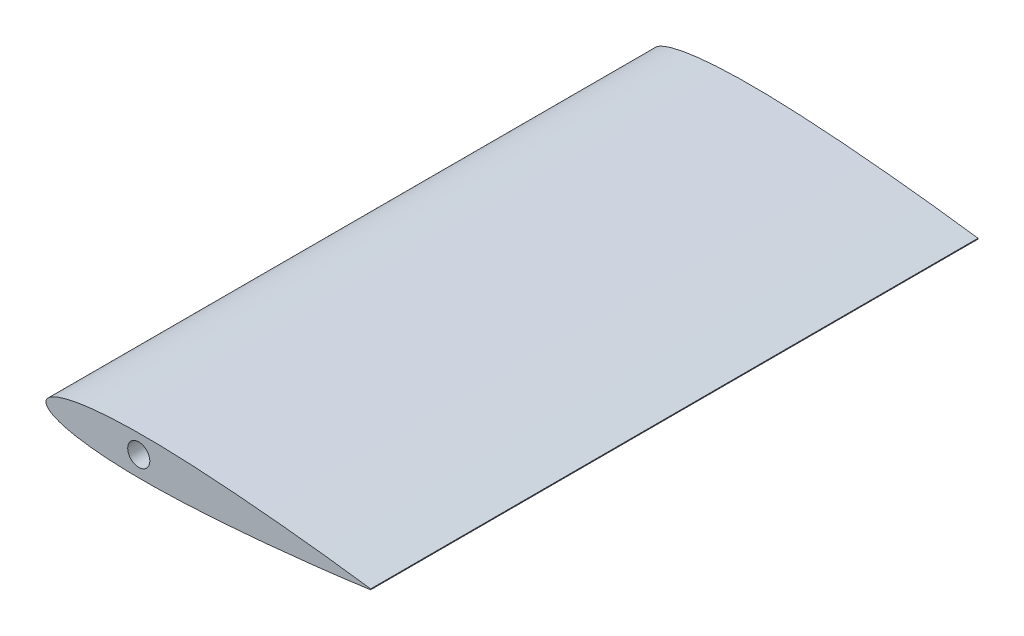
ISO-10303-21;
HEADER;
FILE_DESCRIPTION(('STEP AP214'),'2;1');
FILE_NAME('part.step','',(''),(''),'','','');
FILE_SCHEMA(('AUTOMOTIVE_DESIGN { 1 0 10303 214 1 1 1 1 }'));
ENDSEC;
DATA;
#1=APPLICATION_CONTEXT('core data for automotive mechanical design processes');
#2=APPLICATION_PROTOCOL_DEFINITION('international standard','automotive_design',2000,#1);
#3=PRODUCT_CONTEXT('',#1,'mechanical');
#4=PRODUCT('Part','Part','',(#3));
#5=PRODUCT_RELATED_PRODUCT_CATEGORY('part','',(#4));
#6=PRODUCT_DEFINITION_FORMATION('','',#4);
#7=PRODUCT_DEFINITION_CONTEXT('part definition',#1,'design');
#8=PRODUCT_DEFINITION('design','',#6,#7);
#9=PRODUCT_DEFINITION_SHAPE('','',#8);
#10=(LENGTH_UNIT() NAMED_UNIT(*) SI_UNIT(.MILLI.,.METRE.));
#11=(NAMED_UNIT(*) PLANE_ANGLE_UNIT() SI_UNIT($,.RADIAN.));
#12=(NAMED_UNIT(*) SI_UNIT($,.STERADIAN.) SOLID_ANGLE_UNIT());
#13=UNCERTAINTY_MEASURE_WITH_UNIT(LENGTH_MEASURE(1.E-05),#10,'distance_accuracy_value','');
#14=(GEOMETRIC_REPRESENTATION_CONTEXT(3) GLOBAL_UNCERTAINTY_ASSIGNED_CONTEXT((#13)) GLOBAL_UNIT_ASSIGNED_CONTEXT((#10,
#11,#12)) REPRESENTATION_CONTEXT('',''));
#15=CARTESIAN_POINT('',(0.,0.,0.));
#16=DIRECTION('',(0.,0.,1.));
#17=DIRECTION('',(1.,0.,0.));
#18=AXIS2_PLACEMENT_3D('',#15,#16,#17);
#19=CARTESIAN_POINT('',(0.999999999999996,-0.030492,55.));
#20=CARTESIAN_POINT('',(0.439107200362805,0.0482916430037762,55.));
#21=CARTESIAN_POINT('',(-1.67440318546743,0.334004631039862,55.));
#22=CARTESIAN_POINT('',(-4.61753075382217,0.68424044281171,55.));
#23=CARTESIAN_POINT('',(-8.13265648574757,1.04666058109571,55.));
#24=CARTESIAN_POINT('',(-10.7979695978863,1.28467991908706,55.));
#25=CARTESIAN_POINT('',(-13.3462125522033,1.47149098632113,55.));
#26=CARTESIAN_POINT('',(-15.4585233955373,1.59430214673583,55.));
#27=CARTESIAN_POINT('',(-17.5341249985783,1.67566708670534,55.));
#28=CARTESIAN_POINT('',(-19.5295919390187,1.70658812428436,55.));
#29=CARTESIAN_POINT('',(-21.218108072518,1.68277080165957,55.));
#30=CARTESIAN_POINT('',(-22.5984962646601,1.6201482803771,55.));
#31=CARTESIAN_POINT('',(-23.6814091095408,1.53967512026883,55.));
#32=CARTESIAN_POINT('',(-24.6713537677688,1.43217562844883,55.));
#33=CARTESIAN_POINT('',(-25.4326813593176,1.31828462141949,55.));
#34=CARTESIAN_POINT('',(-25.9876663950995,1.21315529065949,55.));
#35=CARTESIAN_POINT('',(-26.3624753496774,1.13107874990639,55.));
#36=CARTESIAN_POINT('',(-26.7077655636183,1.04362868292588,55.));
#37=CARTESIAN_POINT('',(-27.0227740532249,0.951196851540344,55.));
#38=CARTESIAN_POINT('',(-27.30680622529,0.854090221485334,55.));
#39=CARTESIAN_POINT('',(-27.5592563657164,0.752644177568336,55.));
#40=CARTESIAN_POINT('',(-27.779624737862,0.647151372552298,55.));
#41=CARTESIAN_POINT('',(-27.9674915113008,0.537831437340606,55.));
#42=CARTESIAN_POINT('',(-28.1226379229612,0.42486969062914,55.));
#43=CARTESIAN_POINT('',(-28.2447641879163,0.308080316766064,55.));
#44=CARTESIAN_POINT('',(-28.3335757952812,0.1871324708287,55.));
#45=CARTESIAN_POINT('',(-28.387875352133,0.0614349740101144,55.));
#46=CARTESIAN_POINT('',(-28.4059100610577,-0.0675360000000003,55.));
#47=CARTESIAN_POINT('',(-28.387875352133,-0.196506974010112,55.));
#48=CARTESIAN_POINT('',(-28.3335757952812,-0.322204470828704,55.));
#49=CARTESIAN_POINT('',(-28.2447641879163,-0.443152316766058,55.));
#50=CARTESIAN_POINT('',(-28.1226379229612,-0.559941690629147,55.));
#51=CARTESIAN_POINT('',(-27.9674915113008,-0.672903437340602,55.));
#52=CARTESIAN_POINT('',(-27.779624737862,-0.782223372552299,55.));
#53=CARTESIAN_POINT('',(-27.5592563657164,-0.887716177568338,55.));
#54=CARTESIAN_POINT('',(-27.30680622529,-0.989162221485334,55.));
#55=CARTESIAN_POINT('',(-27.0227740532249,-1.08626885154034,55.));
#56=CARTESIAN_POINT('',(-26.7077655636183,-1.17870068292588,55.));
#57=CARTESIAN_POINT('',(-26.3624753496774,-1.26615074990639,55.));
#58=CARTESIAN_POINT('',(-25.8453176345296,-1.37939915489957,55.));
#59=CARTESIAN_POINT('',(-25.1285876853691,-1.50394081739461,55.));
#60=CARTESIAN_POINT('',(-24.1885879902536,-1.62425936478125,55.));
#61=CARTESIAN_POINT('',(-22.9535044026313,-1.736332976136,55.));
#62=CARTESIAN_POINT('',(-21.4031558298524,-1.81515251551264,55.));
#63=CARTESIAN_POINT('',(-19.2995446770764,-1.84491037015484,55.));
#64=CARTESIAN_POINT('',(-17.0681292430447,-1.79876702122128,55.));
#65=CARTESIAN_POINT('',(-14.7563271985331,-1.69255987178564,55.));
#66=CARTESIAN_POINT('',(-12.6416051474833,-1.55811383616586,55.));
#67=CARTESIAN_POINT('',(-10.3295124754579,-1.37861378181494,55.));
#68=CARTESIAN_POINT('',(-8.30351639758221,-1.19440739049765,55.));
#69=CARTESIAN_POINT('',(-5.69237571783539,-0.932615266100081,55.));
#70=CARTESIAN_POINT('',(-3.10979309525262,-0.643787719924702,55.));
#71=CARTESIAN_POINT('',(-0.644324125665286,-0.330601025685573,55.));
#72=CARTESIAN_POINT('',(0.586969476350031,-0.162396473693552,55.));
#73=CARTESIAN_POINT('',(0.948583439323904,-0.111802028814434,55.));
#74=CARTESIAN_POINT('',(0.999999999999996,-0.10458,55.));
#75=B_SPLINE_CURVE_WITH_KNOTS('',3,(#19,#20,#21,#22,#23,#24,#25,#26,#27,#28,#29,#30,#31,#32,#33,
#34,#35,#36,#37,#38,#39,#40,#41,#42,#43,#44,#45,#46,#47,#48,#49,#50,#51,#52,#53,#54,#55,#56,#57,
#58,#59,#60,#61,#62,#63,#64,#65,#66,#67,#68,#69,#70,#71,#72,#73,#74),.UNSPECIFIED.,.F.,.F.,(4,1,
1,1,1,1,1,1,1,1,1,1,1,1,1,1,1,1,1,1,1,1,1,1,1,1,1,1,1,1,1,1,1,1,1,1,1,1,1,1,1,1,1,1,1,1,1,1,1,1,
1,1,1,4),(0.,0.0283429008690872,0.106722048517726,0.148306054540842,0.205171366742429,
0.240621400483931,0.276160573352716,0.311047092160121,0.344559265520828,0.376017570419826,
0.395537658905913,0.413698812078543,0.430349273099823,0.445356904422305,0.452209372098903,
0.458611567079498,0.46455404405062,0.470029850192537,0.475034902370301,0.479569141493347,
0.483636857140142,0.487250262770083,0.490431337960153,0.493218828079602,0.495674085869199,
0.497891368316545,0.5,0.502108631683455,0.504325914130801,0.506781171920398,0.509568662039847,
0.512749737229918,0.516363142859858,0.520430858506654,0.524965097629699,0.529970149807464,
0.53544595594938,0.541388432920502,0.547790627901097,0.561933980705176,0.577778558712574,
0.595202023801781,0.623982429580175,0.655440734479173,0.700464146399425,0.735649712925285,
0.771241831243212,0.806495956538878,0.851693945459158,0.873039495246583,0.937813387298575,
0.981728387914688,0.997401830647112,1.),.UNSPECIFIED.);
#76=DIRECTION('',(0.,0.,-1.));
#77=VECTOR('',#76,1.);
#78=SURFACE_OF_LINEAR_EXTRUSION('',#75,#77);
#79=CARTESIAN_POINT('',(0.999999999999996,-0.030492,0.));
#80=CARTESIAN_POINT('',(0.439107200362805,0.0482916430037762,0.));
#81=CARTESIAN_POINT('',(-1.67440318546743,0.334004631039862,0.));
#82=CARTESIAN_POINT('',(-4.61753075382217,0.68424044281171,0.));
#83=CARTESIAN_POINT('',(-8.13265648574757,1.04666058109571,0.));
#84=CARTESIAN_POINT('',(-10.7979695978863,1.28467991908706,0.));
#85=CARTESIAN_POINT('',(-13.3462125522033,1.47149098632113,0.));
#86=CARTESIAN_POINT('',(-15.4585233955373,1.59430214673583,0.));
#87=CARTESIAN_POINT('',(-17.5341249985783,1.67566708670534,0.));
#88=CARTESIAN_POINT('',(-19.5295919390187,1.70658812428436,0.));
#89=CARTESIAN_POINT('',(-21.218108072518,1.68277080165957,0.));
#90=CARTESIAN_POINT('',(-22.5984962646601,1.6201482803771,0.));
#91=CARTESIAN_POINT('',(-23.6814091095408,1.53967512026883,0.));
#92=CARTESIAN_POINT('',(-24.6713537677688,1.43217562844883,0.));
#93=CARTESIAN_POINT('',(-25.4326813593176,1.31828462141949,0.));
#94=CARTESIAN_POINT('',(-25.9876663950995,1.21315529065949,0.));
#95=CARTESIAN_POINT('',(-26.3624753496774,1.13107874990639,0.));
#96=CARTESIAN_POINT('',(-26.7077655636183,1.04362868292588,0.));
#97=CARTESIAN_POINT('',(-27.0227740532249,0.951196851540344,0.));
#98=CARTESIAN_POINT('',(-27.30680622529,0.854090221485334,0.));
#99=CARTESIAN_POINT('',(-27.5592563657164,0.752644177568336,0.));
#100=CARTESIAN_POINT('',(-27.779624737862,0.647151372552298,0.));
#101=CARTESIAN_POINT('',(-27.9674915113008,0.537831437340606,0.));
#102=CARTESIAN_POINT('',(-28.1226379229612,0.42486969062914,0.));
#103=CARTESIAN_POINT('',(-28.2447641879163,0.308080316766064,0.));
#104=CARTESIAN_POINT('',(-28.3335757952812,0.1871324708287,0.));
#105=CARTESIAN_POINT('',(-28.387875352133,0.0614349740101144,0.));
#106=CARTESIAN_POINT('',(-28.4059100610577,-0.0675360000000003,0.));
#107=CARTESIAN_POINT('',(-28.387875352133,-0.196506974010112,0.));
#108=CARTESIAN_POINT('',(-28.3335757952812,-0.322204470828704,0.));
#109=CARTESIAN_POINT('',(-28.2447641879163,-0.443152316766058,0.));
#110=CARTESIAN_POINT('',(-28.1226379229612,-0.559941690629147,0.));
#111=CARTESIAN_POINT('',(-27.9674915113008,-0.672903437340602,0.));
#112=CARTESIAN_POINT('',(-27.779624737862,-0.782223372552299,0.));
#113=CARTESIAN_POINT('',(-27.5592563657164,-0.887716177568338,0.));
#114=CARTESIAN_POINT('',(-27.30680622529,-0.989162221485334,0.));
#115=CARTESIAN_POINT('',(-27.0227740532249,-1.08626885154034,0.));
#116=CARTESIAN_POINT('',(-26.7077655636183,-1.17870068292588,0.));
#117=CARTESIAN_POINT('',(-26.3624753496774,-1.26615074990639,0.));
#118=CARTESIAN_POINT('',(-25.8453176345296,-1.37939915489957,0.));
#119=CARTESIAN_POINT('',(-25.1285876853691,-1.50394081739461,0.));
#120=CARTESIAN_POINT('',(-24.1885879902536,-1.62425936478125,0.));
#121=CARTESIAN_POINT('',(-22.9535044026313,-1.736332976136,0.));
#122=CARTESIAN_POINT('',(-21.4031558298524,-1.81515251551264,0.));
#123=CARTESIAN_POINT('',(-19.2995446770764,-1.84491037015484,0.));
#124=CARTESIAN_POINT('',(-17.0681292430447,-1.79876702122128,0.));
#125=CARTESIAN_POINT('',(-14.7563271985331,-1.69255987178564,0.));
#126=CARTESIAN_POINT('',(-12.6416051474833,-1.55811383616586,0.));
#127=CARTESIAN_POINT('',(-10.3295124754579,-1.37861378181494,0.));
#128=CARTESIAN_POINT('',(-8.30351639758221,-1.19440739049765,0.));
#129=CARTESIAN_POINT('',(-5.69237571783539,-0.932615266100081,0.));
#130=CARTESIAN_POINT('',(-3.10979309525262,-0.643787719924702,0.));
#131=CARTESIAN_POINT('',(-0.644324125665286,-0.330601025685573,0.));
#132=CARTESIAN_POINT('',(0.586969476350031,-0.162396473693552,0.));
#133=CARTESIAN_POINT('',(0.948583439323904,-0.111802028814434,0.));
#134=CARTESIAN_POINT('',(0.999999999999996,-0.10458,0.));
#135=B_SPLINE_CURVE_WITH_KNOTS('',3,(#79,#80,#81,#82,#83,#84,#85,#86,#87,#88,#89,#90,#91,#92,
#93,#94,#95,#96,#97,#98,#99,#100,#101,#102,#103,#104,#105,#106,#107,#108,#109,#110,#111,#112,
#113,#114,#115,#116,#117,#118,#119,#120,#121,#122,#123,#124,#125,#126,#127,#128,#129,#130,#131,
#132,#133,#134),.UNSPECIFIED.,.F.,.F.,(4,1,1,1,1,1,1,1,1,1,1,1,1,1,1,1,1,1,1,1,1,1,1,1,1,1,1,1,
1,1,1,1,1,1,1,1,1,1,1,1,1,1,1,1,1,1,1,1,1,1,1,1,1,4),(0.,0.0283429008690872,0.106722048517726,
0.148306054540842,0.205171366742429,0.240621400483931,0.276160573352716,0.311047092160121,
0.344559265520828,0.376017570419826,0.395537658905913,0.413698812078543,0.430349273099823,
0.445356904422305,0.452209372098903,0.458611567079498,0.46455404405062,0.470029850192537,
0.475034902370301,0.479569141493347,0.483636857140142,0.487250262770083,0.490431337960153,
0.493218828079602,0.495674085869199,0.497891368316545,0.5,0.502108631683455,0.504325914130801,
0.506781171920398,0.509568662039847,0.512749737229918,0.516363142859858,0.520430858506654,
0.524965097629699,0.529970149807464,0.53544595594938,0.541388432920502,0.547790627901097,
0.561933980705176,0.577778558712574,0.595202023801781,0.623982429580175,0.655440734479173,
0.700464146399425,0.735649712925285,0.771241831243212,0.806495956538878,0.851693945459158,
0.873039495246583,0.937813387298575,0.981728387914688,0.997401830647112,1.),.UNSPECIFIED.);
#136=CARTESIAN_POINT('',(0.999999999999996,-0.030492,0.));
#137=VERTEX_POINT('',#136);
#138=CARTESIAN_POINT('',(0.999999999999996,-0.10458,0.));
#139=VERTEX_POINT('',#138);
#140=EDGE_CURVE('E65',#137,#139,#135,.T.);
#141=ORIENTED_EDGE('',*,*,#140,.T.);
#142=DIRECTION('',(0.,0.,-1.));
#143=VECTOR('',#142,1.);
#144=CARTESIAN_POINT('',(0.999999999999996,-0.10458,55.));
#145=LINE('',#144,#143);
#146=CARTESIAN_POINT('',(0.999999999999996,-0.10458,55.));
#147=VERTEX_POINT('',#146);
#148=EDGE_CURVE('E11',#147,#139,#145,.T.);
#149=ORIENTED_EDGE('',*,*,#148,.F.);
#150=CARTESIAN_POINT('',(0.999999999999996,-0.030492,55.));
#151=VERTEX_POINT('',#150);
#152=EDGE_CURVE('E64',#151,#147,#75,.T.);
#153=ORIENTED_EDGE('',*,*,#152,.F.);
#154=DIRECTION('',(0.,0.,-1.));
#155=VECTOR('',#154,1.);
#156=CARTESIAN_POINT('',(0.999999999999996,-0.030492,55.));
#157=LINE('',#156,#155);
#158=EDGE_CURVE('E42',#151,#137,#157,.T.);
#159=ORIENTED_EDGE('',*,*,#158,.T.);
#160=EDGE_LOOP('',(#141,#149,#153,#159));
#161=FACE_BOUND('',#160,.T.);
#162=ADVANCED_FACE('F33',(#161),#78,.F.);
#163=CARTESIAN_POINT('',(0.999999999999996,-0.10458,55.));
#164=DIRECTION('',(-1.,0.,0.));
#165=DIRECTION('',(0.,0.,1.));
#166=AXIS2_PLACEMENT_3D('',#163,#164,#165);
#167=PLANE('',#166);
#168=DIRECTION('',(0.,1.,0.));
#169=VECTOR('',#168,1.);
#170=CARTESIAN_POINT('',(0.999999999999996,-0.10458,0.));
#171=LINE('',#170,#169);
#172=EDGE_CURVE('E57',#139,#137,#171,.T.);
#173=ORIENTED_EDGE('',*,*,#172,.T.);
#174=ORIENTED_EDGE('',*,*,#158,.F.);
#175=DIRECTION('',(0.,1.,0.));
#176=VECTOR('',#175,1.);
#177=CARTESIAN_POINT('',(0.999999999999996,-0.10458,55.));
#178=LINE('',#177,#176);
#179=EDGE_CURVE('E49',#147,#151,#178,.T.);
#180=ORIENTED_EDGE('',*,*,#179,.F.);
#181=ORIENTED_EDGE('',*,*,#148,.T.);
#182=EDGE_LOOP('',(#173,#174,#180,#181));
#183=FACE_BOUND('',#182,.T.);
#184=ADVANCED_FACE('F60',(#183),#167,.F.);
#185=CARTESIAN_POINT('',(-28.4,-0.0675359999999933,55.));
#186=DIRECTION('',(0.,0.,-1.));
#187=DIRECTION('',(-1.,0.,0.));
#188=AXIS2_PLACEMENT_3D('',#185,#186,#187);
#189=PLANE('',#188);
#190=CARTESIAN_POINT('',(-20.,0.,55.));
#191=DIRECTION('',(0.,0.,1.));
#192=DIRECTION('',(1.,0.,0.));
#193=AXIS2_PLACEMENT_3D('',#190,#191,#192);
#194=CIRCLE('',#193,1.);
#195=CARTESIAN_POINT('',(-19.,0.,55.));
#196=VERTEX_POINT('',#195);
#197=EDGE_CURVE('E72',#196,#196,#194,.T.);
#198=ORIENTED_EDGE('',*,*,#197,.F.);
#199=EDGE_LOOP('',(#198));
#200=FACE_BOUND('',#199,.T.);
#201=ORIENTED_EDGE('',*,*,#152,.T.);
#202=ORIENTED_EDGE('',*,*,#179,.T.);
#203=EDGE_LOOP('',(#201,#202));
#204=FACE_BOUND('',#203,.T.);
#205=ADVANCED_FACE('F92',(#200,#204),#189,.F.);
#206=CARTESIAN_POINT('',(-28.4,-0.0675359999999933,0.));
#207=DIRECTION('',(0.,0.,-1.));
#208=DIRECTION('',(-1.,0.,0.));
#209=AXIS2_PLACEMENT_3D('',#206,#207,#208);
#210=PLANE('',#209);
#211=CARTESIAN_POINT('',(-20.,0.,0.));
#212=DIRECTION('',(0.,0.,1.));
#213=DIRECTION('',(1.,0.,0.));
#214=AXIS2_PLACEMENT_3D('',#211,#212,#213);
#215=CIRCLE('',#214,1.);
#216=CARTESIAN_POINT('',(-19.,0.,0.));
#217=VERTEX_POINT('',#216);
#218=EDGE_CURVE('E69',#217,#217,#215,.T.);
#219=ORIENTED_EDGE('',*,*,#218,.T.);
#220=EDGE_LOOP('',(#219));
#221=FACE_BOUND('',#220,.T.);
#222=ORIENTED_EDGE('',*,*,#140,.F.);
#223=ORIENTED_EDGE('',*,*,#172,.F.);
#224=EDGE_LOOP('',(#222,#223));
#225=FACE_BOUND('',#224,.T.);
#226=ADVANCED_FACE('F68',(#221,#225),#210,.T.);
#227=CARTESIAN_POINT('',(-20.,0.,0.));
#228=DIRECTION('',(0.,0.,1.));
#229=DIRECTION('',(1.,0.,0.));
#230=AXIS2_PLACEMENT_3D('',#227,#228,#229);
#231=CYLINDRICAL_SURFACE('',#230,1.);
#232=ORIENTED_EDGE('',*,*,#218,.F.);
#233=EDGE_LOOP('',(#232));
#234=FACE_BOUND('',#233,.T.);
#235=ORIENTED_EDGE('',*,*,#197,.T.);
#236=EDGE_LOOP('',(#235));
#237=FACE_BOUND('',#236,.T.);
#238=ADVANCED_FACE('F90',(#234,#237),#231,.F.);
#239=CLOSED_SHELL('',(#162,#184,#205,#226,#238));
#240=MANIFOLD_SOLID_BREP('B2',#239);
#241=ADVANCED_BREP_SHAPE_REPRESENTATION('',(#18,#240),#14);
#242=SHAPE_DEFINITION_REPRESENTATION(#9,#241);
ENDSEC;
END-ISO-10303-21;
